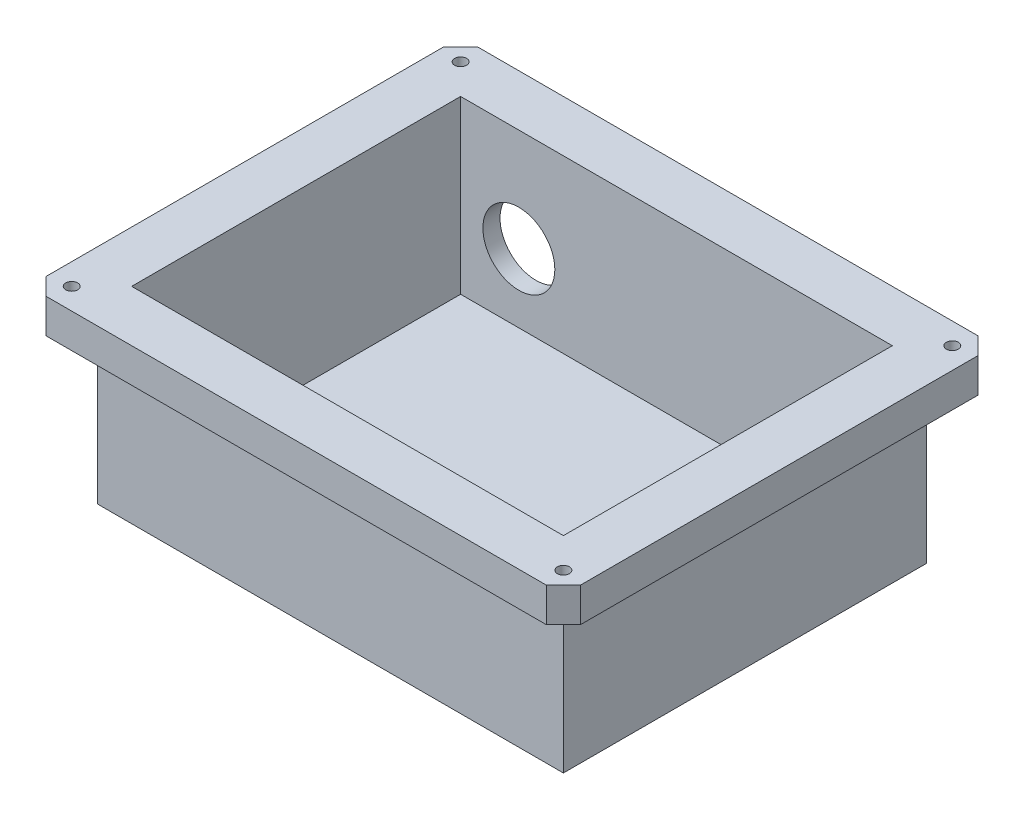
ISO-10303-21;
HEADER;
FILE_DESCRIPTION(('STEP AP214'),'2;1');
FILE_NAME('part.step','',(''),(''),'','','');
FILE_SCHEMA(('AUTOMOTIVE_DESIGN { 1 0 10303 214 1 1 1 1 }'));
ENDSEC;
DATA;
#1=APPLICATION_CONTEXT('core data for automotive mechanical design processes');
#2=APPLICATION_PROTOCOL_DEFINITION('international standard','automotive_design',2000,#1);
#3=PRODUCT_CONTEXT('',#1,'mechanical');
#4=PRODUCT('Part','Part','',(#3));
#5=PRODUCT_RELATED_PRODUCT_CATEGORY('part','',(#4));
#6=PRODUCT_DEFINITION_FORMATION('','',#4);
#7=PRODUCT_DEFINITION_CONTEXT('part definition',#1,'design');
#8=PRODUCT_DEFINITION('design','',#6,#7);
#9=PRODUCT_DEFINITION_SHAPE('','',#8);
#10=(LENGTH_UNIT() NAMED_UNIT(*) SI_UNIT(.MILLI.,.METRE.));
#11=(NAMED_UNIT(*) PLANE_ANGLE_UNIT() SI_UNIT($,.RADIAN.));
#12=(NAMED_UNIT(*) SI_UNIT($,.STERADIAN.) SOLID_ANGLE_UNIT());
#13=UNCERTAINTY_MEASURE_WITH_UNIT(LENGTH_MEASURE(1.E-05),#10,'distance_accuracy_value','');
#14=(GEOMETRIC_REPRESENTATION_CONTEXT(3) GLOBAL_UNCERTAINTY_ASSIGNED_CONTEXT((#13)) GLOBAL_UNIT_ASSIGNED_CONTEXT((#10,
#11,#12)) REPRESENTATION_CONTEXT('',''));
#15=CARTESIAN_POINT('',(0.,0.,0.));
#16=DIRECTION('',(0.,0.,1.));
#17=DIRECTION('',(1.,0.,0.));
#18=AXIS2_PLACEMENT_3D('',#15,#16,#17);
#19=CARTESIAN_POINT('',(0.,40.,0.));
#20=DIRECTION('',(0.,1.,0.));
#21=DIRECTION('',(0.,0.,1.));
#22=AXIS2_PLACEMENT_3D('',#19,#20,#21);
#23=PLANE('',#22);
#24=CARTESIAN_POINT('',(-8.75,40.,17.3574972436604));
#25=DIRECTION('',(0.,-1.,0.));
#26=DIRECTION('',(0.,0.,-1.));
#27=AXIS2_PLACEMENT_3D('',#24,#25,#26);
#28=CIRCLE('',#27,1.75);
#29=CARTESIAN_POINT('',(-8.75,40.,15.6074972436604));
#30=VERTEX_POINT('',#29);
#31=EDGE_CURVE('E611',#30,#30,#28,.T.);
#32=ORIENTED_EDGE('',*,*,#31,.F.);
#33=EDGE_LOOP('',(#32));
#34=FACE_BOUND('',#33,.T.);
#35=CARTESIAN_POINT('',(-8.75,40.,-96.1425027563396));
#36=DIRECTION('',(0.,1.,0.));
#37=DIRECTION('',(0.,0.,1.));
#38=AXIS2_PLACEMENT_3D('',#35,#36,#37);
#39=CIRCLE('',#38,1.75);
#40=CARTESIAN_POINT('',(-8.75,40.,-94.3925027563396));
#41=VERTEX_POINT('',#40);
#42=EDGE_CURVE('E623',#41,#41,#39,.T.);
#43=ORIENTED_EDGE('',*,*,#42,.T.);
#44=EDGE_LOOP('',(#43));
#45=FACE_BOUND('',#44,.T.);
#46=CARTESIAN_POINT('',(134.75,40.,17.3574972436604));
#47=DIRECTION('',(0.,1.,0.));
#48=DIRECTION('',(0.,0.,1.));
#49=AXIS2_PLACEMENT_3D('',#46,#47,#48);
#50=CIRCLE('',#49,1.74999999999998);
#51=CARTESIAN_POINT('',(134.75,40.,19.1074972436604));
#52=VERTEX_POINT('',#51);
#53=EDGE_CURVE('E194',#52,#52,#50,.T.);
#54=ORIENTED_EDGE('',*,*,#53,.T.);
#55=EDGE_LOOP('',(#54));
#56=FACE_BOUND('',#55,.T.);
#57=DIRECTION('',(-1.,0.,0.));
#58=VECTOR('',#57,1.);
#59=CARTESIAN_POINT('',(-5.,40.,-92.3925027563396));
#60=LINE('',#59,#58);
#61=CARTESIAN_POINT('',(131.,40.,-92.3925027563396));
#62=VERTEX_POINT('',#61);
#63=CARTESIAN_POINT('',(-5.,40.,-92.3925027563396));
#64=VERTEX_POINT('',#63);
#65=EDGE_CURVE('E227',#62,#64,#60,.T.);
#66=ORIENTED_EDGE('',*,*,#65,.T.);
#67=DIRECTION('',(0.,0.,1.));
#68=VECTOR('',#67,1.);
#69=CARTESIAN_POINT('',(-5.,40.,-92.3925027563396));
#70=LINE('',#69,#68);
#71=CARTESIAN_POINT('',(-5.,40.,13.6074972436604));
#72=VERTEX_POINT('',#71);
#73=EDGE_CURVE('E215',#64,#72,#70,.T.);
#74=ORIENTED_EDGE('',*,*,#73,.T.);
#75=DIRECTION('',(1.,0.,0.));
#76=VECTOR('',#75,1.);
#77=CARTESIAN_POINT('',(-5.,40.,13.6074972436604));
#78=LINE('',#77,#76);
#79=CARTESIAN_POINT('',(131.,40.,13.6074972436604));
#80=VERTEX_POINT('',#79);
#81=EDGE_CURVE('E219',#72,#80,#78,.T.);
#82=ORIENTED_EDGE('',*,*,#81,.T.);
#83=DIRECTION('',(0.,0.,-1.));
#84=VECTOR('',#83,1.);
#85=CARTESIAN_POINT('',(131.,40.,-92.3925027563396));
#86=LINE('',#85,#84);
#87=EDGE_CURVE('E223',#80,#62,#86,.T.);
#88=ORIENTED_EDGE('',*,*,#87,.T.);
#89=EDGE_LOOP('',(#66,#74,#82,#88));
#90=FACE_BOUND('',#89,.T.);
#91=DIRECTION('',(0.,0.,1.));
#92=VECTOR('',#91,1.);
#93=CARTESIAN_POINT('',(-15.,40.,-102.39250275634));
#94=LINE('',#93,#92);
#95=CARTESIAN_POINT('',(-15.,40.,-97.3925027563395));
#96=VERTEX_POINT('',#95);
#97=CARTESIAN_POINT('',(-15.,40.,18.6074972436604));
#98=VERTEX_POINT('',#97);
#99=EDGE_CURVE('E231',#96,#98,#94,.T.);
#100=ORIENTED_EDGE('',*,*,#99,.F.);
#101=DIRECTION('',(-0.707106781186546,0.,0.707106781186549));
#102=VECTOR('',#101,1.);
#103=CARTESIAN_POINT('',(-9.99999999999997,40.,-102.39250275634));
#104=LINE('',#103,#102);
#105=CARTESIAN_POINT('',(-9.99999999999997,40.,-102.39250275634));
#106=VERTEX_POINT('',#105);
#107=EDGE_CURVE('E337',#96,#106,#104,.F.);
#108=ORIENTED_EDGE('',*,*,#107,.T.);
#109=DIRECTION('',(-1.,0.,0.));
#110=VECTOR('',#109,1.);
#111=CARTESIAN_POINT('',(-15.,40.,-102.39250275634));
#112=LINE('',#111,#110);
#113=CARTESIAN_POINT('',(136.,40.,-102.39250275634));
#114=VERTEX_POINT('',#113);
#115=EDGE_CURVE('E242',#114,#106,#112,.T.);
#116=ORIENTED_EDGE('',*,*,#115,.F.);
#117=DIRECTION('',(-0.707106781186551,0.,-0.707106781186544));
#118=VECTOR('',#117,1.);
#119=CARTESIAN_POINT('',(141.,40.,-97.3925027563396));
#120=LINE('',#119,#118);
#121=CARTESIAN_POINT('',(141.,40.,-97.3925027563396));
#122=VERTEX_POINT('',#121);
#123=EDGE_CURVE('E334',#114,#122,#120,.F.);
#124=ORIENTED_EDGE('',*,*,#123,.T.);
#125=DIRECTION('',(0.,0.,-1.));
#126=VECTOR('',#125,1.);
#127=CARTESIAN_POINT('',(141.,40.,-102.39250275634));
#128=LINE('',#127,#126);
#129=CARTESIAN_POINT('',(141.,40.,18.6074972436604));
#130=VERTEX_POINT('',#129);
#131=EDGE_CURVE('E238',#130,#122,#128,.T.);
#132=ORIENTED_EDGE('',*,*,#131,.F.);
#133=DIRECTION('',(0.707106781186548,0.,-0.707106781186547));
#134=VECTOR('',#133,1.);
#135=CARTESIAN_POINT('',(136.,40.,23.6074972436604));
#136=LINE('',#135,#134);
#137=CARTESIAN_POINT('',(136.,40.,23.6074972436604));
#138=VERTEX_POINT('',#137);
#139=EDGE_CURVE('E58',#130,#138,#136,.F.);
#140=ORIENTED_EDGE('',*,*,#139,.T.);
#141=DIRECTION('',(1.,0.,0.));
#142=VECTOR('',#141,1.);
#143=CARTESIAN_POINT('',(-15.,40.,23.6074972436604));
#144=LINE('',#143,#142);
#145=CARTESIAN_POINT('',(-9.99999999999999,40.,23.6074972436604));
#146=VERTEX_POINT('',#145);
#147=EDGE_CURVE('E235',#146,#138,#144,.T.);
#148=ORIENTED_EDGE('',*,*,#147,.F.);
#149=DIRECTION('',(0.707106781186549,0.,0.707106781186546));
#150=VECTOR('',#149,1.);
#151=CARTESIAN_POINT('',(-15.,40.,18.6074972436604));
#152=LINE('',#151,#150);
#153=EDGE_CURVE('E329',#146,#98,#152,.F.);
#154=ORIENTED_EDGE('',*,*,#153,.T.);
#155=EDGE_LOOP('',(#100,#108,#116,#124,#132,#140,#148,#154));
#156=FACE_BOUND('',#155,.T.);
#157=CARTESIAN_POINT('',(134.75,40.,-96.1425027563396));
#158=DIRECTION('',(0.,-1.,0.));
#159=DIRECTION('',(0.,0.,-1.));
#160=AXIS2_PLACEMENT_3D('',#157,#158,#159);
#161=CIRCLE('',#160,1.74999999999998);
#162=CARTESIAN_POINT('',(134.75,40.,-97.8925027563396));
#163=VERTEX_POINT('',#162);
#164=EDGE_CURVE('E605',#163,#163,#161,.T.);
#165=ORIENTED_EDGE('',*,*,#164,.F.);
#166=EDGE_LOOP('',(#165));
#167=FACE_BOUND('',#166,.T.);
#168=ADVANCED_FACE('F41',(#34,#45,#56,#90,#156,#167),#23,.F.);
#169=CARTESIAN_POINT('',(0.,50.,0.));
#170=DIRECTION('',(0.,1.,0.));
#171=DIRECTION('',(0.,0.,1.));
#172=AXIS2_PLACEMENT_3D('',#169,#170,#171);
#173=PLANE('',#172);
#174=CARTESIAN_POINT('',(-8.75,50.,-96.1425027563396));
#175=DIRECTION('',(0.,1.,0.));
#176=DIRECTION('',(0.,0.,1.));
#177=AXIS2_PLACEMENT_3D('',#174,#175,#176);
#178=CIRCLE('',#177,1.75);
#179=CARTESIAN_POINT('',(-8.75,50.,-94.3925027563396));
#180=VERTEX_POINT('',#179);
#181=EDGE_CURVE('E614',#180,#180,#178,.T.);
#182=ORIENTED_EDGE('',*,*,#181,.F.);
#183=EDGE_LOOP('',(#182));
#184=FACE_BOUND('',#183,.T.);
#185=CARTESIAN_POINT('',(134.75,50.,17.3574972436604));
#186=DIRECTION('',(0.,1.,0.));
#187=DIRECTION('',(0.,0.,1.));
#188=AXIS2_PLACEMENT_3D('',#185,#186,#187);
#189=CIRCLE('',#188,1.74999999999998);
#190=CARTESIAN_POINT('',(134.75,50.,19.1074972436604));
#191=VERTEX_POINT('',#190);
#192=EDGE_CURVE('E188',#191,#191,#189,.T.);
#193=ORIENTED_EDGE('',*,*,#192,.F.);
#194=EDGE_LOOP('',(#193));
#195=FACE_BOUND('',#194,.T.);
#196=DIRECTION('',(-1.,0.,0.));
#197=VECTOR('',#196,1.);
#198=CARTESIAN_POINT('',(-15.,50.,-102.39250275634));
#199=LINE('',#198,#197);
#200=CARTESIAN_POINT('',(136.,50.,-102.39250275634));
#201=VERTEX_POINT('',#200);
#202=CARTESIAN_POINT('',(-9.99999999999997,50.,-102.39250275634));
#203=VERTEX_POINT('',#202);
#204=EDGE_CURVE('E211',#201,#203,#199,.T.);
#205=ORIENTED_EDGE('',*,*,#204,.T.);
#206=DIRECTION('',(0.707106781186546,0.,-0.707106781186549));
#207=VECTOR('',#206,1.);
#208=CARTESIAN_POINT('',(-56.1962513781698,50.,-56.1962513781695));
#209=LINE('',#208,#207);
#210=CARTESIAN_POINT('',(-15.,50.,-97.3925027563395));
#211=VERTEX_POINT('',#210);
#212=EDGE_CURVE('E319',#203,#211,#209,.F.);
#213=ORIENTED_EDGE('',*,*,#212,.T.);
#214=DIRECTION('',(0.,0.,1.));
#215=VECTOR('',#214,1.);
#216=CARTESIAN_POINT('',(-15.,50.,-102.39250275634));
#217=LINE('',#216,#215);
#218=CARTESIAN_POINT('',(-15.,50.,18.6074972436604));
#219=VERTEX_POINT('',#218);
#220=EDGE_CURVE('E183',#211,#219,#217,.T.);
#221=ORIENTED_EDGE('',*,*,#220,.T.);
#222=DIRECTION('',(-0.707106781186549,0.,-0.707106781186546));
#223=VECTOR('',#222,1.);
#224=CARTESIAN_POINT('',(-16.8037486218302,50.,16.8037486218303));
#225=LINE('',#224,#223);
#226=CARTESIAN_POINT('',(-9.99999999999999,50.,23.6074972436604));
#227=VERTEX_POINT('',#226);
#228=EDGE_CURVE('E310',#219,#227,#225,.F.);
#229=ORIENTED_EDGE('',*,*,#228,.T.);
#230=DIRECTION('',(1.,0.,0.));
#231=VECTOR('',#230,1.);
#232=CARTESIAN_POINT('',(-15.,50.,23.6074972436604));
#233=LINE('',#232,#231);
#234=CARTESIAN_POINT('',(136.,50.,23.6074972436604));
#235=VERTEX_POINT('',#234);
#236=EDGE_CURVE('E203',#227,#235,#233,.T.);
#237=ORIENTED_EDGE('',*,*,#236,.T.);
#238=DIRECTION('',(-0.707106781186548,0.,0.707106781186547));
#239=VECTOR('',#238,1.);
#240=CARTESIAN_POINT('',(79.8037486218301,50.,79.8037486218303));
#241=LINE('',#240,#239);
#242=CARTESIAN_POINT('',(141.,50.,18.6074972436604));
#243=VERTEX_POINT('',#242);
#244=EDGE_CURVE('E313',#235,#243,#241,.F.);
#245=ORIENTED_EDGE('',*,*,#244,.T.);
#246=DIRECTION('',(0.,0.,-1.));
#247=VECTOR('',#246,1.);
#248=CARTESIAN_POINT('',(141.,50.,-102.39250275634));
#249=LINE('',#248,#247);
#250=CARTESIAN_POINT('',(141.,50.,-97.3925027563396));
#251=VERTEX_POINT('',#250);
#252=EDGE_CURVE('E207',#243,#251,#249,.T.);
#253=ORIENTED_EDGE('',*,*,#252,.T.);
#254=DIRECTION('',(0.707106781186551,0.,0.707106781186544));
#255=VECTOR('',#254,1.);
#256=CARTESIAN_POINT('',(119.196251378169,50.,-119.19625137817));
#257=LINE('',#256,#255);
#258=EDGE_CURVE('E316',#251,#201,#257,.F.);
#259=ORIENTED_EDGE('',*,*,#258,.T.);
#260=EDGE_LOOP('',(#205,#213,#221,#229,#237,#245,#253,#259));
#261=FACE_BOUND('',#260,.T.);
#262=DIRECTION('',(0.,0.,1.));
#263=VECTOR('',#262,1.);
#264=CARTESIAN_POINT('',(0.,50.,-87.3925027563396));
#265=LINE('',#264,#263);
#266=CARTESIAN_POINT('',(0.,50.,-87.3925027563396));
#267=VERTEX_POINT('',#266);
#268=CARTESIAN_POINT('',(0.,50.,8.60749724366041));
#269=VERTEX_POINT('',#268);
#270=EDGE_CURVE('E181',#267,#269,#265,.T.);
#271=ORIENTED_EDGE('',*,*,#270,.F.);
#272=DIRECTION('',(-1.,0.,0.));
#273=VECTOR('',#272,1.);
#274=CARTESIAN_POINT('',(0.,50.,-87.3925027563396));
#275=LINE('',#274,#273);
#276=CARTESIAN_POINT('',(126.,50.,-87.3925027563396));
#277=VERTEX_POINT('',#276);
#278=EDGE_CURVE('E161',#277,#267,#275,.T.);
#279=ORIENTED_EDGE('',*,*,#278,.F.);
#280=DIRECTION('',(0.,0.,-1.));
#281=VECTOR('',#280,1.);
#282=CARTESIAN_POINT('',(126.,50.,-87.3925027563396));
#283=LINE('',#282,#281);
#284=CARTESIAN_POINT('',(126.,50.,8.6074972436604));
#285=VERTEX_POINT('',#284);
#286=EDGE_CURVE('E178',#285,#277,#283,.T.);
#287=ORIENTED_EDGE('',*,*,#286,.F.);
#288=DIRECTION('',(1.,0.,0.));
#289=VECTOR('',#288,1.);
#290=CARTESIAN_POINT('',(0.,50.,8.60749724366041));
#291=LINE('',#290,#289);
#292=EDGE_CURVE('E187',#269,#285,#291,.T.);
#293=ORIENTED_EDGE('',*,*,#292,.F.);
#294=EDGE_LOOP('',(#271,#279,#287,#293));
#295=FACE_BOUND('',#294,.T.);
#296=CARTESIAN_POINT('',(-8.75,50.,17.3574972436604));
#297=DIRECTION('',(0.,-1.,0.));
#298=DIRECTION('',(0.,0.,-1.));
#299=AXIS2_PLACEMENT_3D('',#296,#297,#298);
#300=CIRCLE('',#299,1.75);
#301=CARTESIAN_POINT('',(-8.75,50.,15.6074972436604));
#302=VERTEX_POINT('',#301);
#303=EDGE_CURVE('E620',#302,#302,#300,.T.);
#304=ORIENTED_EDGE('',*,*,#303,.T.);
#305=EDGE_LOOP('',(#304));
#306=FACE_BOUND('',#305,.T.);
#307=CARTESIAN_POINT('',(134.75,50.,-96.1425027563396));
#308=DIRECTION('',(0.,-1.,0.));
#309=DIRECTION('',(0.,0.,-1.));
#310=AXIS2_PLACEMENT_3D('',#307,#308,#309);
#311=CIRCLE('',#310,1.74999999999998);
#312=CARTESIAN_POINT('',(134.75,50.,-97.8925027563396));
#313=VERTEX_POINT('',#312);
#314=EDGE_CURVE('E602',#313,#313,#311,.T.);
#315=ORIENTED_EDGE('',*,*,#314,.T.);
#316=EDGE_LOOP('',(#315));
#317=FACE_BOUND('',#316,.T.);
#318=ADVANCED_FACE('F175',(#184,#195,#261,#295,#306,#317),#173,.T.);
#319=CARTESIAN_POINT('',(-5.,45.,13.6074972436604));
#320=DIRECTION('',(1.,0.,0.));
#321=DIRECTION('',(0.,0.,-1.));
#322=AXIS2_PLACEMENT_3D('',#319,#320,#321);
#323=PLANE('',#322);
#324=ORIENTED_EDGE('',*,*,#73,.F.);
#325=DIRECTION('',(0.,-1.,0.));
#326=VECTOR('',#325,1.);
#327=CARTESIAN_POINT('',(-5.,45.,-92.3925027563396));
#328=LINE('',#327,#326);
#329=CARTESIAN_POINT('',(-5.,-5.,-92.3925027563396));
#330=VERTEX_POINT('',#329);
#331=EDGE_CURVE('E291',#64,#330,#328,.T.);
#332=ORIENTED_EDGE('',*,*,#331,.T.);
#333=DIRECTION('',(0.,0.,-1.));
#334=VECTOR('',#333,1.);
#335=CARTESIAN_POINT('',(-5.,-5.,13.6074972436604));
#336=LINE('',#335,#334);
#337=CARTESIAN_POINT('',(-5.,-5.,13.6074972436604));
#338=VERTEX_POINT('',#337);
#339=EDGE_CURVE('E251',#338,#330,#336,.T.);
#340=ORIENTED_EDGE('',*,*,#339,.F.);
#341=DIRECTION('',(0.,-1.,0.));
#342=VECTOR('',#341,1.);
#343=CARTESIAN_POINT('',(-5.,45.,13.6074972436604));
#344=LINE('',#343,#342);
#345=EDGE_CURVE('E300',#72,#338,#344,.T.);
#346=ORIENTED_EDGE('',*,*,#345,.F.);
#347=EDGE_LOOP('',(#324,#332,#340,#346));
#348=FACE_BOUND('',#347,.T.);
#349=ADVANCED_FACE('F392',(#348),#323,.F.);
#350=CARTESIAN_POINT('',(-5.,45.,13.6074972436604));
#351=DIRECTION('',(0.,0.,-1.));
#352=DIRECTION('',(-1.,0.,0.));
#353=AXIS2_PLACEMENT_3D('',#350,#351,#352);
#354=PLANE('',#353);
#355=ORIENTED_EDGE('',*,*,#81,.F.);
#356=ORIENTED_EDGE('',*,*,#345,.T.);
#357=DIRECTION('',(-1.,0.,0.));
#358=VECTOR('',#357,1.);
#359=CARTESIAN_POINT('',(-5.,-5.,13.6074972436604));
#360=LINE('',#359,#358);
#361=CARTESIAN_POINT('',(131.,-5.,13.6074972436604));
#362=VERTEX_POINT('',#361);
#363=EDGE_CURVE('E266',#362,#338,#360,.T.);
#364=ORIENTED_EDGE('',*,*,#363,.F.);
#365=DIRECTION('',(0.,-1.,0.));
#366=VECTOR('',#365,1.);
#367=CARTESIAN_POINT('',(131.,45.,13.6074972436604));
#368=LINE('',#367,#366);
#369=EDGE_CURVE('E297',#80,#362,#368,.T.);
#370=ORIENTED_EDGE('',*,*,#369,.F.);
#371=EDGE_LOOP('',(#355,#356,#364,#370));
#372=FACE_BOUND('',#371,.T.);
#373=ADVANCED_FACE('F439',(#372),#354,.F.);
#374=CARTESIAN_POINT('',(131.,45.,13.6074972436604));
#375=DIRECTION('',(-1.,0.,0.));
#376=DIRECTION('',(0.,0.,1.));
#377=AXIS2_PLACEMENT_3D('',#374,#375,#376);
#378=PLANE('',#377);
#379=ORIENTED_EDGE('',*,*,#87,.F.);
#380=ORIENTED_EDGE('',*,*,#369,.T.);
#381=DIRECTION('',(0.,0.,1.));
#382=VECTOR('',#381,1.);
#383=CARTESIAN_POINT('',(131.,-5.,13.6074972436604));
#384=LINE('',#383,#382);
#385=CARTESIAN_POINT('',(131.,-5.,-92.3925027563396));
#386=VERTEX_POINT('',#385);
#387=EDGE_CURVE('E262',#386,#362,#384,.T.);
#388=ORIENTED_EDGE('',*,*,#387,.F.);
#389=DIRECTION('',(0.,-1.,0.));
#390=VECTOR('',#389,1.);
#391=CARTESIAN_POINT('',(131.,45.,-92.3925027563396));
#392=LINE('',#391,#390);
#393=EDGE_CURVE('E294',#62,#386,#392,.T.);
#394=ORIENTED_EDGE('',*,*,#393,.F.);
#395=EDGE_LOOP('',(#379,#380,#388,#394));
#396=FACE_BOUND('',#395,.T.);
#397=ADVANCED_FACE('F435',(#396),#378,.F.);
#398=CARTESIAN_POINT('',(-5.,45.,-92.3925027563396));
#399=DIRECTION('',(0.,0.,1.));
#400=DIRECTION('',(1.,0.,0.));
#401=AXIS2_PLACEMENT_3D('',#398,#399,#400);
#402=PLANE('',#401);
#403=CARTESIAN_POINT('',(17.,20.,-92.3925027563396));
#404=DIRECTION('',(0.,0.,1.));
#405=DIRECTION('',(1.,0.,0.));
#406=AXIS2_PLACEMENT_3D('',#403,#404,#405);
#407=CIRCLE('',#406,10.5);
#408=CARTESIAN_POINT('',(27.5,20.,-92.3925027563396));
#409=VERTEX_POINT('',#408);
#410=EDGE_CURVE('E247',#409,#409,#407,.T.);
#411=ORIENTED_EDGE('',*,*,#410,.T.);
#412=EDGE_LOOP('',(#411));
#413=FACE_BOUND('',#412,.T.);
#414=ORIENTED_EDGE('',*,*,#65,.F.);
#415=ORIENTED_EDGE('',*,*,#393,.T.);
#416=DIRECTION('',(1.,0.,0.));
#417=VECTOR('',#416,1.);
#418=CARTESIAN_POINT('',(-5.,-5.,-92.3925027563396));
#419=LINE('',#418,#417);
#420=EDGE_CURVE('E258',#330,#386,#419,.T.);
#421=ORIENTED_EDGE('',*,*,#420,.F.);
#422=ORIENTED_EDGE('',*,*,#331,.F.);
#423=EDGE_LOOP('',(#414,#415,#421,#422));
#424=FACE_BOUND('',#423,.T.);
#425=ADVANCED_FACE('F431',(#413,#424),#402,.F.);
#426=CARTESIAN_POINT('',(0.,45.,8.60749724366041));
#427=DIRECTION('',(1.,0.,0.));
#428=DIRECTION('',(0.,0.,-1.));
#429=AXIS2_PLACEMENT_3D('',#426,#427,#428);
#430=PLANE('',#429);
#431=DIRECTION('',(0.,0.,1.));
#432=VECTOR('',#431,1.);
#433=CARTESIAN_POINT('',(0.,0.,8.60749724366041));
#434=LINE('',#433,#432);
#435=CARTESIAN_POINT('',(0.,0.,-87.3925027563396));
#436=VERTEX_POINT('',#435);
#437=CARTESIAN_POINT('',(0.,0.,8.60749724366041));
#438=VERTEX_POINT('',#437);
#439=EDGE_CURVE('E270',#436,#438,#434,.T.);
#440=ORIENTED_EDGE('',*,*,#439,.F.);
#441=DIRECTION('',(0.,-1.,0.));
#442=VECTOR('',#441,1.);
#443=CARTESIAN_POINT('',(0.,45.,-87.3925027563396));
#444=LINE('',#443,#442);
#445=EDGE_CURVE('E170',#267,#436,#444,.T.);
#446=ORIENTED_EDGE('',*,*,#445,.F.);
#447=ORIENTED_EDGE('',*,*,#270,.T.);
#448=DIRECTION('',(0.,-1.,0.));
#449=VECTOR('',#448,1.);
#450=CARTESIAN_POINT('',(0.,45.,8.60749724366041));
#451=LINE('',#450,#449);
#452=EDGE_CURVE('E287',#269,#438,#451,.T.);
#453=ORIENTED_EDGE('',*,*,#452,.T.);
#454=EDGE_LOOP('',(#440,#446,#447,#453));
#455=FACE_BOUND('',#454,.T.);
#456=ADVANCED_FACE('F427',(#455),#430,.T.);
#457=CARTESIAN_POINT('',(0.,45.,8.60749724366041));
#458=DIRECTION('',(0.,0.,-1.));
#459=DIRECTION('',(-1.,0.,0.));
#460=AXIS2_PLACEMENT_3D('',#457,#458,#459);
#461=PLANE('',#460);
#462=DIRECTION('',(1.,0.,0.));
#463=VECTOR('',#462,1.);
#464=CARTESIAN_POINT('',(0.,0.,8.60749724366041));
#465=LINE('',#464,#463);
#466=CARTESIAN_POINT('',(126.,0.,8.60749724366041));
#467=VERTEX_POINT('',#466);
#468=EDGE_CURVE('E274',#438,#467,#465,.T.);
#469=ORIENTED_EDGE('',*,*,#468,.F.);
#470=ORIENTED_EDGE('',*,*,#452,.F.);
#471=ORIENTED_EDGE('',*,*,#292,.T.);
#472=DIRECTION('',(0.,-1.,0.));
#473=VECTOR('',#472,1.);
#474=CARTESIAN_POINT('',(126.,45.,8.60749724366041));
#475=LINE('',#474,#473);
#476=EDGE_CURVE('E169',#285,#467,#475,.T.);
#477=ORIENTED_EDGE('',*,*,#476,.T.);
#478=EDGE_LOOP('',(#469,#470,#471,#477));
#479=FACE_BOUND('',#478,.T.);
#480=ADVANCED_FACE('F424',(#479),#461,.T.);
#481=CARTESIAN_POINT('',(126.,45.,8.60749724366041));
#482=DIRECTION('',(-1.,0.,0.));
#483=DIRECTION('',(0.,0.,1.));
#484=AXIS2_PLACEMENT_3D('',#481,#482,#483);
#485=PLANE('',#484);
#486=DIRECTION('',(0.,0.,-1.));
#487=VECTOR('',#486,1.);
#488=CARTESIAN_POINT('',(126.,0.,8.60749724366041));
#489=LINE('',#488,#487);
#490=CARTESIAN_POINT('',(126.,0.,-87.3925027563396));
#491=VERTEX_POINT('',#490);
#492=EDGE_CURVE('E278',#467,#491,#489,.T.);
#493=ORIENTED_EDGE('',*,*,#492,.F.);
#494=ORIENTED_EDGE('',*,*,#476,.F.);
#495=ORIENTED_EDGE('',*,*,#286,.T.);
#496=DIRECTION('',(0.,-1.,0.));
#497=VECTOR('',#496,1.);
#498=CARTESIAN_POINT('',(126.,45.,-87.3925027563396));
#499=LINE('',#498,#497);
#500=EDGE_CURVE('E157',#277,#491,#499,.T.);
#501=ORIENTED_EDGE('',*,*,#500,.T.);
#502=EDGE_LOOP('',(#493,#494,#495,#501));
#503=FACE_BOUND('',#502,.T.);
#504=ADVANCED_FACE('F185',(#503),#485,.T.);
#505=CARTESIAN_POINT('',(0.,45.,-87.3925027563396));
#506=DIRECTION('',(0.,0.,1.));
#507=DIRECTION('',(1.,0.,0.));
#508=AXIS2_PLACEMENT_3D('',#505,#506,#507);
#509=PLANE('',#508);
#510=CARTESIAN_POINT('',(17.,20.,-87.3925027563396));
#511=DIRECTION('',(0.,0.,1.));
#512=DIRECTION('',(1.,0.,0.));
#513=AXIS2_PLACEMENT_3D('',#510,#511,#512);
#514=CIRCLE('',#513,10.5);
#515=CARTESIAN_POINT('',(27.5,20.,-87.3925027563396));
#516=VERTEX_POINT('',#515);
#517=EDGE_CURVE('E246',#516,#516,#514,.T.);
#518=ORIENTED_EDGE('',*,*,#517,.F.);
#519=EDGE_LOOP('',(#518));
#520=FACE_BOUND('',#519,.T.);
#521=DIRECTION('',(-1.,0.,0.));
#522=VECTOR('',#521,1.);
#523=CARTESIAN_POINT('',(0.,0.,-87.3925027563396));
#524=LINE('',#523,#522);
#525=EDGE_CURVE('E163',#491,#436,#524,.T.);
#526=ORIENTED_EDGE('',*,*,#525,.F.);
#527=ORIENTED_EDGE('',*,*,#500,.F.);
#528=ORIENTED_EDGE('',*,*,#278,.T.);
#529=ORIENTED_EDGE('',*,*,#445,.T.);
#530=EDGE_LOOP('',(#526,#527,#528,#529));
#531=FACE_BOUND('',#530,.T.);
#532=ADVANCED_FACE('F159',(#520,#531),#509,.T.);
#533=CARTESIAN_POINT('',(0.,0.,0.));
#534=DIRECTION('',(0.,-1.,0.));
#535=DIRECTION('',(0.,0.,-1.));
#536=AXIS2_PLACEMENT_3D('',#533,#534,#535);
#537=PLANE('',#536);
#538=ORIENTED_EDGE('',*,*,#492,.T.);
#539=ORIENTED_EDGE('',*,*,#525,.T.);
#540=ORIENTED_EDGE('',*,*,#439,.T.);
#541=ORIENTED_EDGE('',*,*,#468,.T.);
#542=EDGE_LOOP('',(#538,#539,#540,#541));
#543=FACE_BOUND('',#542,.T.);
#544=ADVANCED_FACE('F414',(#543),#537,.F.);
#545=CARTESIAN_POINT('',(0.,-5.,0.));
#546=DIRECTION('',(0.,-1.,0.));
#547=DIRECTION('',(0.,0.,-1.));
#548=AXIS2_PLACEMENT_3D('',#545,#546,#547);
#549=PLANE('',#548);
#550=ORIENTED_EDGE('',*,*,#339,.T.);
#551=ORIENTED_EDGE('',*,*,#420,.T.);
#552=ORIENTED_EDGE('',*,*,#387,.T.);
#553=ORIENTED_EDGE('',*,*,#363,.T.);
#554=EDGE_LOOP('',(#550,#551,#552,#553));
#555=FACE_BOUND('',#554,.T.);
#556=ADVANCED_FACE('F410',(#555),#549,.T.);
#557=CARTESIAN_POINT('',(17.,20.,-92.3925027563396));
#558=DIRECTION('',(0.,0.,1.));
#559=DIRECTION('',(1.,0.,0.));
#560=AXIS2_PLACEMENT_3D('',#557,#558,#559);
#561=CYLINDRICAL_SURFACE('',#560,10.5);
#562=ORIENTED_EDGE('',*,*,#410,.F.);
#563=EDGE_LOOP('',(#562));
#564=FACE_BOUND('',#563,.T.);
#565=ORIENTED_EDGE('',*,*,#517,.T.);
#566=EDGE_LOOP('',(#565));
#567=FACE_BOUND('',#566,.T.);
#568=ADVANCED_FACE('F407',(#564,#567),#561,.F.);
#569=CARTESIAN_POINT('',(-15.,40.,-102.39250275634));
#570=DIRECTION('',(-1.,0.,0.));
#571=DIRECTION('',(0.,0.,1.));
#572=AXIS2_PLACEMENT_3D('',#569,#570,#571);
#573=PLANE('',#572);
#574=ORIENTED_EDGE('',*,*,#220,.F.);
#575=DIRECTION('',(0.,-1.,0.));
#576=VECTOR('',#575,1.);
#577=CARTESIAN_POINT('',(-15.,40.,-97.3925027563395));
#578=LINE('',#577,#576);
#579=EDGE_CURVE('E326',#211,#96,#578,.T.);
#580=ORIENTED_EDGE('',*,*,#579,.T.);
#581=ORIENTED_EDGE('',*,*,#99,.T.);
#582=DIRECTION('',(0.,1.,0.));
#583=VECTOR('',#582,1.);
#584=CARTESIAN_POINT('',(-15.,40.,18.6074972436604));
#585=LINE('',#584,#583);
#586=EDGE_CURVE('E322',#98,#219,#585,.T.);
#587=ORIENTED_EDGE('',*,*,#586,.T.);
#588=EDGE_LOOP('',(#574,#580,#581,#587));
#589=FACE_BOUND('',#588,.T.);
#590=ADVANCED_FACE('F367',(#589),#573,.T.);
#591=CARTESIAN_POINT('',(-15.,40.,-102.39250275634));
#592=DIRECTION('',(0.,0.,-1.));
#593=DIRECTION('',(-1.,0.,0.));
#594=AXIS2_PLACEMENT_3D('',#591,#592,#593);
#595=PLANE('',#594);
#596=ORIENTED_EDGE('',*,*,#115,.T.);
#597=DIRECTION('',(0.,1.,0.));
#598=VECTOR('',#597,1.);
#599=CARTESIAN_POINT('',(-9.99999999999997,40.,-102.39250275634));
#600=LINE('',#599,#598);
#601=EDGE_CURVE('E306',#106,#203,#600,.T.);
#602=ORIENTED_EDGE('',*,*,#601,.T.);
#603=ORIENTED_EDGE('',*,*,#204,.F.);
#604=DIRECTION('',(0.,-1.,0.));
#605=VECTOR('',#604,1.);
#606=CARTESIAN_POINT('',(136.,40.,-102.39250275634));
#607=LINE('',#606,#605);
#608=EDGE_CURVE('E303',#201,#114,#607,.T.);
#609=ORIENTED_EDGE('',*,*,#608,.T.);
#610=EDGE_LOOP('',(#596,#602,#603,#609));
#611=FACE_BOUND('',#610,.T.);
#612=ADVANCED_FACE('F374',(#611),#595,.T.);
#613=CARTESIAN_POINT('',(141.,40.,-102.39250275634));
#614=DIRECTION('',(1.,0.,0.));
#615=DIRECTION('',(0.,0.,-1.));
#616=AXIS2_PLACEMENT_3D('',#613,#614,#615);
#617=PLANE('',#616);
#618=ORIENTED_EDGE('',*,*,#131,.T.);
#619=DIRECTION('',(0.,1.,0.));
#620=VECTOR('',#619,1.);
#621=CARTESIAN_POINT('',(141.,40.,-97.3925027563396));
#622=LINE('',#621,#620);
#623=EDGE_CURVE('E343',#122,#251,#622,.T.);
#624=ORIENTED_EDGE('',*,*,#623,.T.);
#625=ORIENTED_EDGE('',*,*,#252,.F.);
#626=DIRECTION('',(0.,-1.,0.));
#627=VECTOR('',#626,1.);
#628=CARTESIAN_POINT('',(141.,40.,18.6074972436604));
#629=LINE('',#628,#627);
#630=EDGE_CURVE('E340',#243,#130,#629,.T.);
#631=ORIENTED_EDGE('',*,*,#630,.T.);
#632=EDGE_LOOP('',(#618,#624,#625,#631));
#633=FACE_BOUND('',#632,.T.);
#634=ADVANCED_FACE('F350',(#633),#617,.T.);
#635=CARTESIAN_POINT('',(-15.,40.,23.6074972436604));
#636=DIRECTION('',(0.,0.,1.));
#637=DIRECTION('',(1.,0.,0.));
#638=AXIS2_PLACEMENT_3D('',#635,#636,#637);
#639=PLANE('',#638);
#640=ORIENTED_EDGE('',*,*,#147,.T.);
#641=DIRECTION('',(0.,1.,0.));
#642=VECTOR('',#641,1.);
#643=CARTESIAN_POINT('',(136.,40.,23.6074972436604));
#644=LINE('',#643,#642);
#645=EDGE_CURVE('E11',#138,#235,#644,.T.);
#646=ORIENTED_EDGE('',*,*,#645,.T.);
#647=ORIENTED_EDGE('',*,*,#236,.F.);
#648=DIRECTION('',(0.,-1.,0.));
#649=VECTOR('',#648,1.);
#650=CARTESIAN_POINT('',(-9.99999999999999,40.,23.6074972436604));
#651=LINE('',#650,#649);
#652=EDGE_CURVE('E51',#227,#146,#651,.T.);
#653=ORIENTED_EDGE('',*,*,#652,.T.);
#654=EDGE_LOOP('',(#640,#646,#647,#653));
#655=FACE_BOUND('',#654,.T.);
#656=ADVANCED_FACE('F359',(#655),#639,.T.);
#657=CARTESIAN_POINT('',(-9.99999999999997,40.,-102.39250275634));
#658=DIRECTION('',(0.707106781186549,0.,0.707106781186546));
#659=DIRECTION('',(0.,1.,0.));
#660=AXIS2_PLACEMENT_3D('',#657,#658,#659);
#661=PLANE('',#660);
#662=ORIENTED_EDGE('',*,*,#107,.F.);
#663=ORIENTED_EDGE('',*,*,#579,.F.);
#664=ORIENTED_EDGE('',*,*,#212,.F.);
#665=ORIENTED_EDGE('',*,*,#601,.F.);
#666=EDGE_LOOP('',(#662,#663,#664,#665));
#667=FACE_BOUND('',#666,.T.);
#668=ADVANCED_FACE('F372',(#667),#661,.F.);
#669=CARTESIAN_POINT('',(141.,40.,-97.3925027563396));
#670=DIRECTION('',(-0.707106781186543,0.,0.707106781186551));
#671=DIRECTION('',(0.,1.,0.));
#672=AXIS2_PLACEMENT_3D('',#669,#670,#671);
#673=PLANE('',#672);
#674=ORIENTED_EDGE('',*,*,#123,.F.);
#675=ORIENTED_EDGE('',*,*,#608,.F.);
#676=ORIENTED_EDGE('',*,*,#258,.F.);
#677=ORIENTED_EDGE('',*,*,#623,.F.);
#678=EDGE_LOOP('',(#674,#675,#676,#677));
#679=FACE_BOUND('',#678,.T.);
#680=ADVANCED_FACE('F377',(#679),#673,.F.);
#681=CARTESIAN_POINT('',(136.,40.,23.6074972436604));
#682=DIRECTION('',(-0.707106781186547,0.,-0.707106781186548));
#683=DIRECTION('',(0.,1.,0.));
#684=AXIS2_PLACEMENT_3D('',#681,#682,#683);
#685=PLANE('',#684);
#686=ORIENTED_EDGE('',*,*,#139,.F.);
#687=ORIENTED_EDGE('',*,*,#630,.F.);
#688=ORIENTED_EDGE('',*,*,#244,.F.);
#689=ORIENTED_EDGE('',*,*,#645,.F.);
#690=EDGE_LOOP('',(#686,#687,#688,#689));
#691=FACE_BOUND('',#690,.T.);
#692=ADVANCED_FACE('F358',(#691),#685,.F.);
#693=CARTESIAN_POINT('',(-15.,40.,18.6074972436604));
#694=DIRECTION('',(0.707106781186546,0.,-0.707106781186549));
#695=DIRECTION('',(0.,1.,0.));
#696=AXIS2_PLACEMENT_3D('',#693,#694,#695);
#697=PLANE('',#696);
#698=ORIENTED_EDGE('',*,*,#153,.F.);
#699=ORIENTED_EDGE('',*,*,#652,.F.);
#700=ORIENTED_EDGE('',*,*,#228,.F.);
#701=ORIENTED_EDGE('',*,*,#586,.F.);
#702=EDGE_LOOP('',(#698,#699,#700,#701));
#703=FACE_BOUND('',#702,.T.);
#704=ADVANCED_FACE('F44',(#703),#697,.F.);
#705=CARTESIAN_POINT('',(134.75,50.,17.3574972436604));
#706=DIRECTION('',(0.,-1.,0.));
#707=DIRECTION('',(0.,0.,-1.));
#708=AXIS2_PLACEMENT_3D('',#705,#706,#707);
#709=CYLINDRICAL_SURFACE('',#708,1.74999999999998);
#710=ORIENTED_EDGE('',*,*,#192,.T.);
#711=EDGE_LOOP('',(#710));
#712=FACE_BOUND('',#711,.T.);
#713=ORIENTED_EDGE('',*,*,#53,.F.);
#714=EDGE_LOOP('',(#713));
#715=FACE_BOUND('',#714,.T.);
#716=ADVANCED_FACE('F548',(#712,#715),#709,.F.);
#717=CARTESIAN_POINT('',(-8.75,50.,-96.1425027563396));
#718=DIRECTION('',(0.,-1.,0.));
#719=DIRECTION('',(0.,0.,-1.));
#720=AXIS2_PLACEMENT_3D('',#717,#718,#719);
#721=CYLINDRICAL_SURFACE('',#720,1.75);
#722=ORIENTED_EDGE('',*,*,#181,.T.);
#723=EDGE_LOOP('',(#722));
#724=FACE_BOUND('',#723,.T.);
#725=ORIENTED_EDGE('',*,*,#42,.F.);
#726=EDGE_LOOP('',(#725));
#727=FACE_BOUND('',#726,.T.);
#728=ADVANCED_FACE('F566',(#724,#727),#721,.F.);
#729=CARTESIAN_POINT('',(-8.75,50.,17.3574972436604));
#730=DIRECTION('',(0.,-1.,0.));
#731=DIRECTION('',(0.,0.,-1.));
#732=AXIS2_PLACEMENT_3D('',#729,#730,#731);
#733=CYLINDRICAL_SURFACE('',#732,1.75);
#734=ORIENTED_EDGE('',*,*,#303,.F.);
#735=EDGE_LOOP('',(#734));
#736=FACE_BOUND('',#735,.T.);
#737=ORIENTED_EDGE('',*,*,#31,.T.);
#738=EDGE_LOOP('',(#737));
#739=FACE_BOUND('',#738,.T.);
#740=ADVANCED_FACE('F575',(#736,#739),#733,.F.);
#741=CARTESIAN_POINT('',(134.75,50.,-96.1425027563396));
#742=DIRECTION('',(0.,-1.,0.));
#743=DIRECTION('',(0.,0.,-1.));
#744=AXIS2_PLACEMENT_3D('',#741,#742,#743);
#745=CYLINDRICAL_SURFACE('',#744,1.74999999999998);
#746=ORIENTED_EDGE('',*,*,#314,.F.);
#747=EDGE_LOOP('',(#746));
#748=FACE_BOUND('',#747,.T.);
#749=ORIENTED_EDGE('',*,*,#164,.T.);
#750=EDGE_LOOP('',(#749));
#751=FACE_BOUND('',#750,.T.);
#752=ADVANCED_FACE('F585',(#748,#751),#745,.F.);
#753=CLOSED_SHELL('',(#168,#318,#349,#373,#397,#425,#456,#480,#504,#532,#544,#556,#568,#590,
#612,#634,#656,#668,#680,#692,#704,#716,#728,#740,#752));
#754=MANIFOLD_SOLID_BREP('B2',#753);
#755=ADVANCED_BREP_SHAPE_REPRESENTATION('',(#18,#754),#14);
#756=SHAPE_DEFINITION_REPRESENTATION(#9,#755);
ENDSEC;
END-ISO-10303-21;
